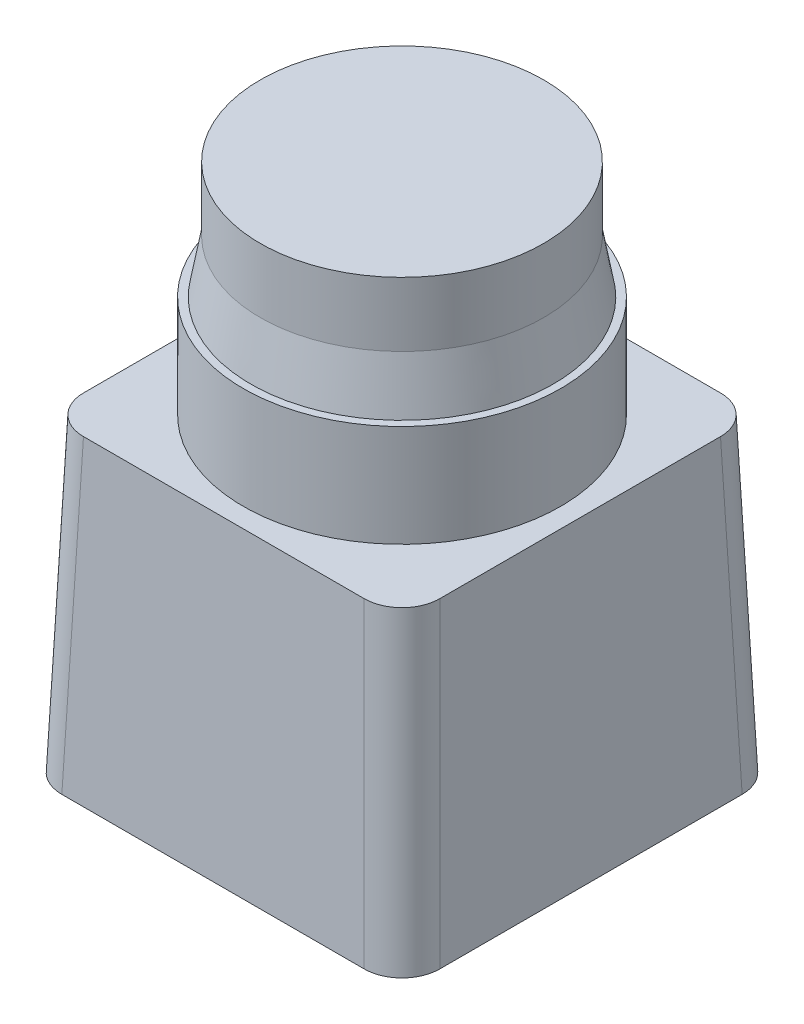
ISO-10303-21;
HEADER;
FILE_DESCRIPTION(('STEP AP214'),'2;1');
FILE_NAME('part.step','',(''),(''),'','','');
FILE_SCHEMA(('AUTOMOTIVE_DESIGN { 1 0 10303 214 1 1 1 1 }'));
ENDSEC;
DATA;
#1=APPLICATION_CONTEXT('core data for automotive mechanical design processes');
#2=APPLICATION_PROTOCOL_DEFINITION('international standard','automotive_design',2000,#1);
#3=PRODUCT_CONTEXT('',#1,'mechanical');
#4=PRODUCT('Part','Part','',(#3));
#5=PRODUCT_RELATED_PRODUCT_CATEGORY('part','',(#4));
#6=PRODUCT_DEFINITION_FORMATION('','',#4);
#7=PRODUCT_DEFINITION_CONTEXT('part definition',#1,'design');
#8=PRODUCT_DEFINITION('design','',#6,#7);
#9=PRODUCT_DEFINITION_SHAPE('','',#8);
#10=(LENGTH_UNIT() NAMED_UNIT(*) SI_UNIT(.MILLI.,.METRE.));
#11=(NAMED_UNIT(*) PLANE_ANGLE_UNIT() SI_UNIT($,.RADIAN.));
#12=(NAMED_UNIT(*) SI_UNIT($,.STERADIAN.) SOLID_ANGLE_UNIT());
#13=UNCERTAINTY_MEASURE_WITH_UNIT(LENGTH_MEASURE(1.E-05),#10,'distance_accuracy_value','');
#14=(GEOMETRIC_REPRESENTATION_CONTEXT(3) GLOBAL_UNCERTAINTY_ASSIGNED_CONTEXT((#13)) GLOBAL_UNIT_ASSIGNED_CONTEXT((#10,
#11,#12)) REPRESENTATION_CONTEXT('',''));
#15=CARTESIAN_POINT('',(0.,0.,0.));
#16=DIRECTION('',(0.,0.,1.));
#17=DIRECTION('',(1.,0.,0.));
#18=AXIS2_PLACEMENT_3D('',#15,#16,#17);
#19=CARTESIAN_POINT('',(-25.,0.,-25.));
#20=DIRECTION('',(-0.999390827019096,0.034899496702501,0.));
#21=DIRECTION('',(-0.034899496702501,-0.999390827019096,0.));
#22=AXIS2_PLACEMENT_3D('',#19,#20,#21);
#23=PLANE('',#22);
#24=DIRECTION('',(0.,0.,1.));
#25=VECTOR('',#24,1.);
#26=CARTESIAN_POINT('',(-25.,0.,-25.));
#27=LINE('',#26,#25);
#28=CARTESIAN_POINT('',(-25.,0.,-20.0030458649045));
#29=VERTEX_POINT('',#28);
#30=CARTESIAN_POINT('',(-25.,0.,20.0030458649045));
#31=VERTEX_POINT('',#30);
#32=EDGE_CURVE('E277',#29,#31,#27,.T.);
#33=ORIENTED_EDGE('',*,*,#32,.T.);
#34=DIRECTION('',(0.0348782627423746,0.998782765958718,-0.0348782627423747));
#35=VECTOR('',#34,1.);
#36=CARTESIAN_POINT('',(-24.9452541001893,1.56771745317907,19.9482999650939));
#37=LINE('',#36,#35);
#38=CARTESIAN_POINT('',(-23.5682484508383,41.,18.5712943157429));
#39=VERTEX_POINT('',#38);
#40=EDGE_CURVE('E314',#31,#39,#37,.T.);
#41=ORIENTED_EDGE('',*,*,#40,.T.);
#42=DIRECTION('',(0.,0.,-1.));
#43=VECTOR('',#42,1.);
#44=CARTESIAN_POINT('',(-23.5682484508384,41.,-25.));
#45=LINE('',#44,#43);
#46=CARTESIAN_POINT('',(-23.5682484508384,41.,-18.5712943157429));
#47=VERTEX_POINT('',#46);
#48=EDGE_CURVE('E289',#47,#39,#45,.F.);
#49=ORIENTED_EDGE('',*,*,#48,.F.);
#50=DIRECTION('',(0.0348782627423747,0.998782765958718,0.0348782627423747));
#51=VECTOR('',#50,1.);
#52=CARTESIAN_POINT('',(-25.0060787607857,-0.174072933504123,-20.0091246256902));
#53=LINE('',#52,#51);
#54=EDGE_CURVE('E311',#47,#29,#53,.F.);
#55=ORIENTED_EDGE('',*,*,#54,.T.);
#56=EDGE_LOOP('',(#33,#41,#49,#55));
#57=FACE_BOUND('',#56,.T.);
#58=CARTESIAN_POINT('',(-24.7939674599987,5.9,16.1));
#59=DIRECTION('',(-0.999390827019096,0.034899496702501,0.));
#60=DIRECTION('',(-0.034899496702501,-0.999390827019096,0.));
#61=AXIS2_PLACEMENT_3D('',#58,#59,#60);
#62=ELLIPSE('',#61,1.00060954429882,1.);
#63=CARTESIAN_POINT('',(-24.8288882294904,4.9,16.1));
#64=VERTEX_POINT('',#63);
#65=CARTESIAN_POINT('',(-24.7939674599987,5.9,17.1));
#66=VERTEX_POINT('',#65);
#67=EDGE_CURVE('E11',#64,#66,#62,.T.);
#68=ORIENTED_EDGE('',*,*,#67,.F.);
#69=DIRECTION('',(0.,0.,-1.));
#70=VECTOR('',#69,1.);
#71=CARTESIAN_POINT('',(-24.8288882294904,4.89999999999999,-25.));
#72=LINE('',#71,#70);
#73=CARTESIAN_POINT('',(-24.8288882294904,4.9,11.1));
#74=VERTEX_POINT('',#73);
#75=EDGE_CURVE('E45',#74,#64,#72,.F.);
#76=ORIENTED_EDGE('',*,*,#75,.F.);
#77=CARTESIAN_POINT('',(-24.7939674599987,5.9,11.1));
#78=DIRECTION('',(-0.999390827019096,0.034899496702501,0.));
#79=DIRECTION('',(-0.034899496702501,-0.999390827019096,0.));
#80=AXIS2_PLACEMENT_3D('',#77,#78,#79);
#81=ELLIPSE('',#80,1.00060954429882,1.);
#82=CARTESIAN_POINT('',(-24.7939674599987,5.9,10.1));
#83=VERTEX_POINT('',#82);
#84=EDGE_CURVE('E344',#83,#74,#81,.T.);
#85=ORIENTED_EDGE('',*,*,#84,.F.);
#86=DIRECTION('',(0.034899496702501,0.999390827019096,0.));
#87=VECTOR('',#86,1.);
#88=CARTESIAN_POINT('',(-25.,0.,10.1));
#89=LINE('',#88,#87);
#90=CARTESIAN_POINT('',(-24.7241259210152,7.9,10.1));
#91=VERTEX_POINT('',#90);
#92=EDGE_CURVE('E342',#91,#83,#89,.F.);
#93=ORIENTED_EDGE('',*,*,#92,.F.);
#94=CARTESIAN_POINT('',(-24.7241259210152,7.9,11.1));
#95=DIRECTION('',(-0.999390827019096,0.034899496702501,0.));
#96=DIRECTION('',(-0.034899496702501,-0.999390827019096,0.));
#97=AXIS2_PLACEMENT_3D('',#94,#95,#96);
#98=ELLIPSE('',#97,1.00060954429882,1.);
#99=CARTESIAN_POINT('',(-24.6892051515234,8.9,11.1));
#100=VERTEX_POINT('',#99);
#101=EDGE_CURVE('E340',#100,#91,#98,.T.);
#102=ORIENTED_EDGE('',*,*,#101,.F.);
#103=DIRECTION('',(0.,0.,1.));
#104=VECTOR('',#103,1.);
#105=CARTESIAN_POINT('',(-24.6892051515235,8.90000000000002,-25.));
#106=LINE('',#105,#104);
#107=CARTESIAN_POINT('',(-24.6892051515234,8.9,16.1));
#108=VERTEX_POINT('',#107);
#109=EDGE_CURVE('E338',#108,#100,#106,.F.);
#110=ORIENTED_EDGE('',*,*,#109,.F.);
#111=CARTESIAN_POINT('',(-24.7241259210152,7.9,16.1));
#112=DIRECTION('',(-0.999390827019096,0.034899496702501,0.));
#113=DIRECTION('',(-0.034899496702501,-0.999390827019096,0.));
#114=AXIS2_PLACEMENT_3D('',#111,#112,#113);
#115=ELLIPSE('',#114,1.00060954429882,1.);
#116=CARTESIAN_POINT('',(-24.7241259210152,7.9,17.1));
#117=VERTEX_POINT('',#116);
#118=EDGE_CURVE('E336',#117,#108,#115,.T.);
#119=ORIENTED_EDGE('',*,*,#118,.F.);
#120=DIRECTION('',(-0.034899496702501,-0.999390827019096,0.));
#121=VECTOR('',#120,1.);
#122=CARTESIAN_POINT('',(-25.,0.,17.1));
#123=LINE('',#122,#121);
#124=EDGE_CURVE('E334',#66,#117,#123,.F.);
#125=ORIENTED_EDGE('',*,*,#124,.F.);
#126=EDGE_LOOP('',(#68,#76,#85,#93,#102,#110,#119,#125));
#127=FACE_BOUND('',#126,.T.);
#128=ADVANCED_FACE('F37',(#57,#127),#23,.T.);
#129=CARTESIAN_POINT('',(25.,0.,-25.));
#130=DIRECTION('',(0.999390827019096,0.034899496702501,0.));
#131=DIRECTION('',(-0.034899496702501,0.999390827019096,0.));
#132=AXIS2_PLACEMENT_3D('',#129,#130,#131);
#133=PLANE('',#132);
#134=DIRECTION('',(0.,0.,1.));
#135=VECTOR('',#134,1.);
#136=CARTESIAN_POINT('',(23.5682484508383,41.,-25.));
#137=LINE('',#136,#135);
#138=CARTESIAN_POINT('',(23.5682484508383,41.,18.5712943157429));
#139=VERTEX_POINT('',#138);
#140=CARTESIAN_POINT('',(23.5682484508383,41.,-18.5712943157429));
#141=VERTEX_POINT('',#140);
#142=EDGE_CURVE('E283',#139,#141,#137,.F.);
#143=ORIENTED_EDGE('',*,*,#142,.F.);
#144=DIRECTION('',(-0.0348782627423747,0.998782765958718,-0.0348782627423747));
#145=VECTOR('',#144,1.);
#146=CARTESIAN_POINT('',(24.9452541001893,1.56771745317907,19.9482999650939));
#147=LINE('',#146,#145);
#148=CARTESIAN_POINT('',(25.,0.,20.0030458649045));
#149=VERTEX_POINT('',#148);
#150=EDGE_CURVE('E331',#139,#149,#147,.F.);
#151=ORIENTED_EDGE('',*,*,#150,.T.);
#152=DIRECTION('',(0.,0.,-1.));
#153=VECTOR('',#152,1.);
#154=CARTESIAN_POINT('',(25.,0.,-25.));
#155=LINE('',#154,#153);
#156=CARTESIAN_POINT('',(25.,0.,-20.0030458649045));
#157=VERTEX_POINT('',#156);
#158=EDGE_CURVE('E271',#149,#157,#155,.T.);
#159=ORIENTED_EDGE('',*,*,#158,.T.);
#160=DIRECTION('',(-0.0348782627423746,0.998782765958718,0.0348782627423747));
#161=VECTOR('',#160,1.);
#162=CARTESIAN_POINT('',(25.0060787607856,-0.174072933504123,-20.0091246256902));
#163=LINE('',#162,#161);
#164=EDGE_CURVE('E329',#157,#141,#163,.T.);
#165=ORIENTED_EDGE('',*,*,#164,.T.);
#166=EDGE_LOOP('',(#143,#151,#159,#165));
#167=FACE_BOUND('',#166,.T.);
#168=ADVANCED_FACE('F405',(#167),#133,.T.);
#169=CARTESIAN_POINT('',(-25.,0.,-25.));
#170=DIRECTION('',(0.,0.034899496702501,-0.999390827019096));
#171=DIRECTION('',(0.,0.999390827019096,0.034899496702501));
#172=AXIS2_PLACEMENT_3D('',#169,#170,#171);
#173=PLANE('',#172);
#174=DIRECTION('',(-1.,0.,0.));
#175=VECTOR('',#174,1.);
#176=CARTESIAN_POINT('',(-25.,0.,-25.));
#177=LINE('',#176,#175);
#178=CARTESIAN_POINT('',(20.0030458649045,0.,-25.));
#179=VERTEX_POINT('',#178);
#180=CARTESIAN_POINT('',(-20.0030458649045,0.,-25.));
#181=VERTEX_POINT('',#180);
#182=EDGE_CURVE('E274',#179,#181,#177,.T.);
#183=ORIENTED_EDGE('',*,*,#182,.T.);
#184=DIRECTION('',(0.0348782627423747,0.998782765958718,0.0348782627423746));
#185=VECTOR('',#184,1.);
#186=CARTESIAN_POINT('',(-20.0091246256902,-0.174072933504123,-25.0060787607856));
#187=LINE('',#186,#185);
#188=CARTESIAN_POINT('',(-18.5712943157429,41.,-23.5682484508383));
#189=VERTEX_POINT('',#188);
#190=EDGE_CURVE('E327',#181,#189,#187,.T.);
#191=ORIENTED_EDGE('',*,*,#190,.T.);
#192=DIRECTION('',(1.,0.,0.));
#193=VECTOR('',#192,1.);
#194=CARTESIAN_POINT('',(-25.,41.,-23.5682484508383));
#195=LINE('',#194,#193);
#196=CARTESIAN_POINT('',(18.5712943157428,41.,-23.5682484508383));
#197=VERTEX_POINT('',#196);
#198=EDGE_CURVE('E286',#197,#189,#195,.F.);
#199=ORIENTED_EDGE('',*,*,#198,.F.);
#200=DIRECTION('',(-0.0348782627423746,0.998782765958718,0.0348782627423746));
#201=VECTOR('',#200,1.);
#202=CARTESIAN_POINT('',(19.9482999650939,1.56771745317907,-24.9452541001893));
#203=LINE('',#202,#201);
#204=EDGE_CURVE('E324',#197,#179,#203,.F.);
#205=ORIENTED_EDGE('',*,*,#204,.T.);
#206=EDGE_LOOP('',(#183,#191,#199,#205));
#207=FACE_BOUND('',#206,.T.);
#208=ADVANCED_FACE('F411',(#207),#173,.T.);
#209=CARTESIAN_POINT('',(-25.,0.,25.));
#210=DIRECTION('',(0.,0.034899496702501,0.999390827019096));
#211=DIRECTION('',(0.,-0.999390827019096,0.034899496702501));
#212=AXIS2_PLACEMENT_3D('',#209,#210,#211);
#213=PLANE('',#212);
#214=DIRECTION('',(-1.,0.,0.));
#215=VECTOR('',#214,1.);
#216=CARTESIAN_POINT('',(-25.,41.,23.5682484508383));
#217=LINE('',#216,#215);
#218=CARTESIAN_POINT('',(-18.5712943157429,41.,23.5682484508383));
#219=VERTEX_POINT('',#218);
#220=CARTESIAN_POINT('',(18.5712943157429,41.,23.5682484508383));
#221=VERTEX_POINT('',#220);
#222=EDGE_CURVE('E292',#219,#221,#217,.F.);
#223=ORIENTED_EDGE('',*,*,#222,.F.);
#224=DIRECTION('',(0.0348782627423746,0.998782765958718,-0.0348782627423746));
#225=VECTOR('',#224,1.);
#226=CARTESIAN_POINT('',(-20.0091246256902,-0.174072933504123,25.0060787607857));
#227=LINE('',#226,#225);
#228=CARTESIAN_POINT('',(-20.0030458649045,0.,25.));
#229=VERTEX_POINT('',#228);
#230=EDGE_CURVE('E300',#219,#229,#227,.F.);
#231=ORIENTED_EDGE('',*,*,#230,.T.);
#232=DIRECTION('',(1.,0.,0.));
#233=VECTOR('',#232,1.);
#234=CARTESIAN_POINT('',(-25.,0.,25.));
#235=LINE('',#234,#233);
#236=CARTESIAN_POINT('',(20.0030458649045,0.,25.));
#237=VERTEX_POINT('',#236);
#238=EDGE_CURVE('E280',#229,#237,#235,.T.);
#239=ORIENTED_EDGE('',*,*,#238,.T.);
#240=DIRECTION('',(-0.0348782627423747,0.998782765958718,-0.0348782627423746));
#241=VECTOR('',#240,1.);
#242=CARTESIAN_POINT('',(19.9482999650939,1.56771745317907,24.9452541001893));
#243=LINE('',#242,#241);
#244=EDGE_CURVE('E298',#237,#221,#243,.T.);
#245=ORIENTED_EDGE('',*,*,#244,.T.);
#246=EDGE_LOOP('',(#223,#231,#239,#245));
#247=FACE_BOUND('',#246,.T.);
#248=ADVANCED_FACE('F416',(#247),#213,.T.);
#249=CARTESIAN_POINT('',(0.,41.,0.));
#250=DIRECTION('',(0.,1.,0.));
#251=DIRECTION('',(0.,0.,1.));
#252=AXIS2_PLACEMENT_3D('',#249,#250,#251);
#253=PLANE('',#252);
#254=DIRECTION('',(0.173648177666931,0.,-0.984807753012208));
#255=VECTOR('',#254,1.);
#256=CARTESIAN_POINT('',(3.82025990867248,41.,-21.6657705662686));
#257=LINE('',#256,#255);
#258=CARTESIAN_POINT('',(3.64661173100555,41.,-20.6809628132564));
#259=VERTEX_POINT('',#258);
#260=CARTESIAN_POINT('',(3.82025990867248,41.,-21.6657705662686));
#261=VERTEX_POINT('',#260);
#262=EDGE_CURVE('E234',#259,#261,#257,.T.);
#263=ORIENTED_EDGE('',*,*,#262,.F.);
#264=CARTESIAN_POINT('',(0.,41.,0.));
#265=DIRECTION('',(0.,1.,0.));
#266=DIRECTION('',(0.,0.,1.));
#267=AXIS2_PLACEMENT_3D('',#264,#265,#266);
#268=CIRCLE('',#267,21.);
#269=CARTESIAN_POINT('',(-3.64661173100555,41.,-20.6809628132564));
#270=VERTEX_POINT('',#269);
#271=EDGE_CURVE('E295',#270,#259,#268,.T.);
#272=ORIENTED_EDGE('',*,*,#271,.F.);
#273=DIRECTION('',(-0.173648177666931,0.,-0.984807753012208));
#274=VECTOR('',#273,1.);
#275=CARTESIAN_POINT('',(-3.82025990867248,41.,-21.6657705662686));
#276=LINE('',#275,#274);
#277=CARTESIAN_POINT('',(-3.82025990867248,41.,-21.6657705662686));
#278=VERTEX_POINT('',#277);
#279=EDGE_CURVE('E217',#270,#278,#276,.T.);
#280=ORIENTED_EDGE('',*,*,#279,.T.);
#281=CARTESIAN_POINT('',(0.,41.,0.));
#282=DIRECTION('',(0.,1.,0.));
#283=DIRECTION('',(0.,0.,1.));
#284=AXIS2_PLACEMENT_3D('',#281,#282,#283);
#285=CIRCLE('',#284,22.);
#286=EDGE_CURVE('E59',#261,#278,#285,.T.);
#287=ORIENTED_EDGE('',*,*,#286,.F.);
#288=EDGE_LOOP('',(#263,#272,#280,#287));
#289=FACE_BOUND('',#288,.T.);
#290=ORIENTED_EDGE('',*,*,#48,.T.);
#291=CARTESIAN_POINT('',(-18.5652007293442,41.,18.5652007293442));
#292=DIRECTION('',(0.,1.,0.));
#293=DIRECTION('',(-0.707106781186547,0.,0.707106781186548));
#294=AXIS2_PLACEMENT_3D('',#291,#292,#293);
#295=ELLIPSE('',#294,5.00609358752858,5.);
#296=EDGE_CURVE('E322',#39,#219,#295,.T.);
#297=ORIENTED_EDGE('',*,*,#296,.T.);
#298=ORIENTED_EDGE('',*,*,#222,.T.);
#299=CARTESIAN_POINT('',(18.5652007293442,41.,18.5652007293442));
#300=DIRECTION('',(0.,1.,0.));
#301=DIRECTION('',(0.707106781186548,0.,0.707106781186547));
#302=AXIS2_PLACEMENT_3D('',#299,#300,#301);
#303=ELLIPSE('',#302,5.00609358752858,5.);
#304=EDGE_CURVE('E318',#221,#139,#303,.T.);
#305=ORIENTED_EDGE('',*,*,#304,.T.);
#306=ORIENTED_EDGE('',*,*,#142,.T.);
#307=CARTESIAN_POINT('',(18.5652007293442,41.,-18.5652007293442));
#308=DIRECTION('',(0.,1.,0.));
#309=DIRECTION('',(0.707106781186547,0.,-0.707106781186548));
#310=AXIS2_PLACEMENT_3D('',#307,#308,#309);
#311=ELLIPSE('',#310,5.00609358752858,5.);
#312=EDGE_CURVE('E316',#141,#197,#311,.T.);
#313=ORIENTED_EDGE('',*,*,#312,.T.);
#314=ORIENTED_EDGE('',*,*,#198,.T.);
#315=CARTESIAN_POINT('',(-18.5652007293442,41.,-18.5652007293442));
#316=DIRECTION('',(0.,1.,0.));
#317=DIRECTION('',(-0.707106781186548,0.,-0.707106781186547));
#318=AXIS2_PLACEMENT_3D('',#315,#316,#317);
#319=ELLIPSE('',#318,5.00609358752858,5.);
#320=EDGE_CURVE('E320',#189,#47,#319,.T.);
#321=ORIENTED_EDGE('',*,*,#320,.T.);
#322=EDGE_LOOP('',(#290,#297,#298,#305,#306,#313,#314,#321));
#323=FACE_BOUND('',#322,.T.);
#324=ADVANCED_FACE('F441',(#289,#323),#253,.T.);
#325=CARTESIAN_POINT('',(0.,0.,0.));
#326=DIRECTION('',(0.,1.,0.));
#327=DIRECTION('',(0.,0.,1.));
#328=AXIS2_PLACEMENT_3D('',#325,#326,#327);
#329=PLANE('',#328);
#330=CARTESIAN_POINT('',(20.,0.,19.375));
#331=DIRECTION('',(0.,-1.,0.));
#332=DIRECTION('',(0.,0.,-1.));
#333=AXIS2_PLACEMENT_3D('',#330,#331,#332);
#334=CIRCLE('',#333,1.25);
#335=CARTESIAN_POINT('',(20.,0.,18.125));
#336=VERTEX_POINT('',#335);
#337=EDGE_CURVE('E247',#336,#336,#334,.T.);
#338=ORIENTED_EDGE('',*,*,#337,.F.);
#339=EDGE_LOOP('',(#338));
#340=FACE_BOUND('',#339,.T.);
#341=CARTESIAN_POINT('',(-20.,0.,-20.625));
#342=DIRECTION('',(0.,-1.,0.));
#343=DIRECTION('',(0.,0.,-1.));
#344=AXIS2_PLACEMENT_3D('',#341,#342,#343);
#345=CIRCLE('',#344,1.25);
#346=CARTESIAN_POINT('',(-20.,0.,-21.875));
#347=VERTEX_POINT('',#346);
#348=EDGE_CURVE('E251',#347,#347,#345,.T.);
#349=ORIENTED_EDGE('',*,*,#348,.F.);
#350=EDGE_LOOP('',(#349));
#351=FACE_BOUND('',#350,.T.);
#352=ORIENTED_EDGE('',*,*,#238,.F.);
#353=CARTESIAN_POINT('',(-19.9969522785059,0.,19.9969522785059));
#354=DIRECTION('',(0.,1.,0.));
#355=DIRECTION('',(-0.707106781186547,0.,0.707106781186548));
#356=AXIS2_PLACEMENT_3D('',#353,#354,#355);
#357=ELLIPSE('',#356,5.00609358752858,5.);
#358=EDGE_CURVE('E309',#229,#31,#357,.F.);
#359=ORIENTED_EDGE('',*,*,#358,.T.);
#360=ORIENTED_EDGE('',*,*,#32,.F.);
#361=CARTESIAN_POINT('',(-19.9969522785059,0.,-19.9969522785059));
#362=DIRECTION('',(0.,1.,0.));
#363=DIRECTION('',(-0.707106781186548,0.,-0.707106781186547));
#364=AXIS2_PLACEMENT_3D('',#361,#362,#363);
#365=ELLIPSE('',#364,5.00609358752858,5.);
#366=EDGE_CURVE('E307',#29,#181,#365,.F.);
#367=ORIENTED_EDGE('',*,*,#366,.T.);
#368=ORIENTED_EDGE('',*,*,#182,.F.);
#369=CARTESIAN_POINT('',(19.9969522785059,0.,-19.9969522785059));
#370=DIRECTION('',(0.,1.,0.));
#371=DIRECTION('',(0.707106781186547,0.,-0.707106781186548));
#372=AXIS2_PLACEMENT_3D('',#369,#370,#371);
#373=ELLIPSE('',#372,5.00609358752858,5.);
#374=EDGE_CURVE('E303',#179,#157,#373,.F.);
#375=ORIENTED_EDGE('',*,*,#374,.T.);
#376=ORIENTED_EDGE('',*,*,#158,.F.);
#377=CARTESIAN_POINT('',(19.9969522785059,0.,19.9969522785059));
#378=DIRECTION('',(0.,1.,0.));
#379=DIRECTION('',(0.707106781186548,0.,0.707106781186547));
#380=AXIS2_PLACEMENT_3D('',#377,#378,#379);
#381=ELLIPSE('',#380,5.00609358752858,5.);
#382=EDGE_CURVE('E305',#149,#237,#381,.F.);
#383=ORIENTED_EDGE('',*,*,#382,.T.);
#384=EDGE_LOOP('',(#352,#359,#360,#367,#368,#375,#376,#383));
#385=FACE_BOUND('',#384,.T.);
#386=ADVANCED_FACE('F460',(#340,#351,#385),#329,.F.);
#387=CARTESIAN_POINT('',(0.,41.,0.));
#388=DIRECTION('',(0.,-1.,0.));
#389=DIRECTION('',(0.,0.,-1.));
#390=AXIS2_PLACEMENT_3D('',#387,#388,#389);
#391=CYLINDRICAL_SURFACE('',#390,21.);
#392=DIRECTION('',(0.,-1.,0.));
#393=VECTOR('',#392,1.);
#394=CARTESIAN_POINT('',(3.64661173100555,54.5,-20.6809628132564));
#395=LINE('',#394,#393);
#396=CARTESIAN_POINT('',(3.64661173100555,54.5,-20.6809628132564));
#397=VERTEX_POINT('',#396);
#398=EDGE_CURVE('E231',#397,#259,#395,.T.);
#399=ORIENTED_EDGE('',*,*,#398,.F.);
#400=CARTESIAN_POINT('',(0.,54.5,0.));
#401=DIRECTION('',(0.,-1.,0.));
#402=DIRECTION('',(0.,0.,-1.));
#403=AXIS2_PLACEMENT_3D('',#400,#401,#402);
#404=CIRCLE('',#403,21.);
#405=CARTESIAN_POINT('',(-3.64661173100554,54.5,-20.6809628132564));
#406=VERTEX_POINT('',#405);
#407=EDGE_CURVE('E268',#397,#406,#404,.T.);
#408=ORIENTED_EDGE('',*,*,#407,.T.);
#409=DIRECTION('',(0.,-1.,0.));
#410=VECTOR('',#409,1.);
#411=CARTESIAN_POINT('',(-3.64661173100554,54.5,-20.6809628132564));
#412=LINE('',#411,#410);
#413=EDGE_CURVE('E215',#406,#270,#412,.T.);
#414=ORIENTED_EDGE('',*,*,#413,.T.);
#415=ORIENTED_EDGE('',*,*,#271,.T.);
#416=EDGE_LOOP('',(#399,#408,#414,#415));
#417=FACE_BOUND('',#416,.T.);
#418=ADVANCED_FACE('F462',(#417),#391,.T.);
#419=CARTESIAN_POINT('',(0.,54.5,-3.78169717762946E-13));
#420=DIRECTION('',(0.,-1.,0.));
#421=DIRECTION('',(0.,0.,-1.));
#422=AXIS2_PLACEMENT_3D('',#419,#420,#421);
#423=PLANE('',#422);
#424=ORIENTED_EDGE('',*,*,#407,.F.);
#425=DIRECTION('',(0.173648177666931,0.,-0.984807753012208));
#426=VECTOR('',#425,1.);
#427=CARTESIAN_POINT('',(3.47296355333862,54.5,-19.6961550602442));
#428=LINE('',#427,#426);
#429=CARTESIAN_POINT('',(3.47296355333862,54.5,-19.6961550602442));
#430=VERTEX_POINT('',#429);
#431=EDGE_CURVE('E228',#430,#397,#428,.T.);
#432=ORIENTED_EDGE('',*,*,#431,.F.);
#433=CARTESIAN_POINT('',(0.,54.5,0.));
#434=DIRECTION('',(0.,-1.,0.));
#435=DIRECTION('',(0.,0.,-1.));
#436=AXIS2_PLACEMENT_3D('',#433,#434,#435);
#437=CIRCLE('',#436,20.);
#438=CARTESIAN_POINT('',(-3.47296355333861,54.5,-19.6961550602442));
#439=VERTEX_POINT('',#438);
#440=EDGE_CURVE('E265',#430,#439,#437,.T.);
#441=ORIENTED_EDGE('',*,*,#440,.T.);
#442=DIRECTION('',(-0.173648177666931,0.,-0.984807753012208));
#443=VECTOR('',#442,1.);
#444=CARTESIAN_POINT('',(-3.47296355333861,54.5,-19.6961550602442));
#445=LINE('',#444,#443);
#446=EDGE_CURVE('E208',#439,#406,#445,.T.);
#447=ORIENTED_EDGE('',*,*,#446,.T.);
#448=EDGE_LOOP('',(#424,#432,#441,#447));
#449=FACE_BOUND('',#448,.T.);
#450=ADVANCED_FACE('F469',(#449),#423,.F.);
#451=CARTESIAN_POINT('',(0.,61.5,0.));
#452=DIRECTION('',(0.,-1.,0.));
#453=DIRECTION('',(0.,0.,-1.));
#454=AXIS2_PLACEMENT_3D('',#451,#452,#453);
#455=CONICAL_SURFACE('',#454,18.75,0.176708856070038);
#456=ORIENTED_EDGE('',*,*,#440,.F.);
#457=DIRECTION('',(0.0305257240235937,-0.984427575508481,-0.173119983685674));
#458=VECTOR('',#457,1.);
#459=CARTESIAN_POINT('',(3.30241623598717,60.,-18.7289331599643));
#460=LINE('',#459,#458);
#461=CARTESIAN_POINT('',(3.30241623598717,60.,-18.7289331599643));
#462=VERTEX_POINT('',#461);
#463=EDGE_CURVE('E225',#462,#430,#460,.T.);
#464=ORIENTED_EDGE('',*,*,#463,.F.);
#465=CARTESIAN_POINT('',(0.,60.,0.));
#466=DIRECTION('',(0.,1.,0.));
#467=DIRECTION('',(0.,0.,1.));
#468=AXIS2_PLACEMENT_3D('',#465,#466,#467);
#469=CIRCLE('',#468,19.0178571428571);
#470=CARTESIAN_POINT('',(-3.30241623598716,60.,-18.7289331599643));
#471=VERTEX_POINT('',#470);
#472=EDGE_CURVE('E242',#462,#471,#469,.T.);
#473=ORIENTED_EDGE('',*,*,#472,.T.);
#474=DIRECTION('',(-0.0305257240235937,-0.984427575508481,-0.173119983685674));
#475=VECTOR('',#474,1.);
#476=CARTESIAN_POINT('',(-3.30241623598716,60.,-18.7289331599643));
#477=LINE('',#476,#475);
#478=EDGE_CURVE('E205',#471,#439,#477,.T.);
#479=ORIENTED_EDGE('',*,*,#478,.T.);
#480=EDGE_LOOP('',(#456,#464,#473,#479));
#481=FACE_BOUND('',#480,.T.);
#482=CARTESIAN_POINT('',(0.,61.5,0.));
#483=DIRECTION('',(0.,-1.,0.));
#484=DIRECTION('',(0.,0.,-1.));
#485=AXIS2_PLACEMENT_3D('',#482,#483,#484);
#486=CIRCLE('',#485,18.75);
#487=CARTESIAN_POINT('',(0.,61.5,-18.75));
#488=VERTEX_POINT('',#487);
#489=EDGE_CURVE('E262',#488,#488,#486,.T.);
#490=ORIENTED_EDGE('',*,*,#489,.T.);
#491=EDGE_LOOP('',(#490));
#492=FACE_BOUND('',#491,.T.);
#493=ADVANCED_FACE('F478',(#481,#492),#455,.T.);
#494=CARTESIAN_POINT('',(0.,41.,0.));
#495=DIRECTION('',(0.,-1.,0.));
#496=DIRECTION('',(0.,0.,-1.));
#497=AXIS2_PLACEMENT_3D('',#494,#495,#496);
#498=CYLINDRICAL_SURFACE('',#497,18.75);
#499=ORIENTED_EDGE('',*,*,#489,.F.);
#500=EDGE_LOOP('',(#499));
#501=FACE_BOUND('',#500,.T.);
#502=CARTESIAN_POINT('',(0.,70.,0.));
#503=DIRECTION('',(0.,-1.,0.));
#504=DIRECTION('',(0.,0.,-1.));
#505=AXIS2_PLACEMENT_3D('',#502,#503,#504);
#506=CIRCLE('',#505,18.75);
#507=CARTESIAN_POINT('',(0.,70.,-18.75));
#508=VERTEX_POINT('',#507);
#509=EDGE_CURVE('E257',#508,#508,#506,.T.);
#510=ORIENTED_EDGE('',*,*,#509,.T.);
#511=EDGE_LOOP('',(#510));
#512=FACE_BOUND('',#511,.T.);
#513=ADVANCED_FACE('F482',(#501,#512),#498,.T.);
#514=CARTESIAN_POINT('',(0.,70.,0.));
#515=DIRECTION('',(0.,-1.,0.));
#516=DIRECTION('',(0.,0.,-1.));
#517=AXIS2_PLACEMENT_3D('',#514,#515,#516);
#518=PLANE('',#517);
#519=ORIENTED_EDGE('',*,*,#509,.F.);
#520=EDGE_LOOP('',(#519));
#521=FACE_BOUND('',#520,.T.);
#522=ADVANCED_FACE('F424',(#521),#518,.F.);
#523=CARTESIAN_POINT('',(-20.0091246256902,-0.348570417016628,20.0091246256902));
#524=DIRECTION('',(-0.0348782627423746,-0.998782765958718,0.0348782627423747));
#525=DIRECTION('',(0.,-0.034899496702501,-0.999390827019096));
#526=AXIS2_PLACEMENT_3D('',#523,#524,#525);
#527=CYLINDRICAL_SURFACE('',#526,5.);
#528=ORIENTED_EDGE('',*,*,#296,.F.);
#529=ORIENTED_EDGE('',*,*,#40,.F.);
#530=ORIENTED_EDGE('',*,*,#358,.F.);
#531=ORIENTED_EDGE('',*,*,#230,.F.);
#532=EDGE_LOOP('',(#528,#529,#530,#531));
#533=FACE_BOUND('',#532,.T.);
#534=ADVANCED_FACE('F420',(#533),#527,.T.);
#535=CARTESIAN_POINT('',(-20.0091246256902,-0.348570417016628,-20.0091246256902));
#536=DIRECTION('',(-0.0348782627423747,-0.998782765958718,-0.0348782627423747));
#537=DIRECTION('',(0.999390827019096,-0.034899496702501,0.));
#538=AXIS2_PLACEMENT_3D('',#535,#536,#537);
#539=CYLINDRICAL_SURFACE('',#538,5.);
#540=ORIENTED_EDGE('',*,*,#320,.F.);
#541=ORIENTED_EDGE('',*,*,#190,.F.);
#542=ORIENTED_EDGE('',*,*,#366,.F.);
#543=ORIENTED_EDGE('',*,*,#54,.F.);
#544=EDGE_LOOP('',(#540,#541,#542,#543));
#545=FACE_BOUND('',#544,.T.);
#546=ADVANCED_FACE('F423',(#545),#539,.T.);
#547=CARTESIAN_POINT('',(19.9482999650939,1.39321996966657,19.9482999650939));
#548=DIRECTION('',(0.0348782627423747,-0.998782765958718,0.0348782627423747));
#549=DIRECTION('',(0.999390827019096,0.034899496702501,0.));
#550=AXIS2_PLACEMENT_3D('',#547,#548,#549);
#551=CYLINDRICAL_SURFACE('',#550,5.);
#552=ORIENTED_EDGE('',*,*,#304,.F.);
#553=ORIENTED_EDGE('',*,*,#244,.F.);
#554=ORIENTED_EDGE('',*,*,#382,.F.);
#555=ORIENTED_EDGE('',*,*,#150,.F.);
#556=EDGE_LOOP('',(#552,#553,#554,#555));
#557=FACE_BOUND('',#556,.T.);
#558=ADVANCED_FACE('F427',(#557),#551,.T.);
#559=CARTESIAN_POINT('',(19.9482999650939,1.39321996966657,-19.9482999650939));
#560=DIRECTION('',(0.0348782627423746,-0.998782765958718,-0.0348782627423747));
#561=DIRECTION('',(0.,0.034899496702501,-0.999390827019096));
#562=AXIS2_PLACEMENT_3D('',#559,#560,#561);
#563=CYLINDRICAL_SURFACE('',#562,5.);
#564=ORIENTED_EDGE('',*,*,#312,.F.);
#565=ORIENTED_EDGE('',*,*,#164,.F.);
#566=ORIENTED_EDGE('',*,*,#374,.F.);
#567=ORIENTED_EDGE('',*,*,#204,.F.);
#568=EDGE_LOOP('',(#564,#565,#566,#567));
#569=FACE_BOUND('',#568,.T.);
#570=ADVANCED_FACE('F39',(#569),#563,.T.);
#571=CARTESIAN_POINT('',(-20.,6.,-20.625));
#572=DIRECTION('',(0.,-1.,0.));
#573=DIRECTION('',(0.,0.,-1.));
#574=AXIS2_PLACEMENT_3D('',#571,#572,#573);
#575=CYLINDRICAL_SURFACE('',#574,1.25);
#576=CARTESIAN_POINT('',(-20.,6.,-20.625));
#577=DIRECTION('',(0.,-1.,0.));
#578=DIRECTION('',(0.,0.,-1.));
#579=AXIS2_PLACEMENT_3D('',#576,#577,#578);
#580=CIRCLE('',#579,1.25);
#581=CARTESIAN_POINT('',(-20.,6.,-21.875));
#582=VERTEX_POINT('',#581);
#583=EDGE_CURVE('E254',#582,#582,#580,.T.);
#584=ORIENTED_EDGE('',*,*,#583,.F.);
#585=EDGE_LOOP('',(#584));
#586=FACE_BOUND('',#585,.T.);
#587=ORIENTED_EDGE('',*,*,#348,.T.);
#588=EDGE_LOOP('',(#587));
#589=FACE_BOUND('',#588,.T.);
#590=ADVANCED_FACE('F434',(#586,#589),#575,.F.);
#591=CARTESIAN_POINT('',(-20.,6.,-20.625));
#592=DIRECTION('',(0.,-1.,0.));
#593=DIRECTION('',(0.,0.,-1.));
#594=AXIS2_PLACEMENT_3D('',#591,#592,#593);
#595=PLANE('',#594);
#596=ORIENTED_EDGE('',*,*,#583,.T.);
#597=EDGE_LOOP('',(#596));
#598=FACE_BOUND('',#597,.T.);
#599=ADVANCED_FACE('F492',(#598),#595,.T.);
#600=CARTESIAN_POINT('',(20.,6.,19.375));
#601=DIRECTION('',(0.,-1.,0.));
#602=DIRECTION('',(0.,0.,-1.));
#603=AXIS2_PLACEMENT_3D('',#600,#601,#602);
#604=CYLINDRICAL_SURFACE('',#603,1.25);
#605=CARTESIAN_POINT('',(20.,6.,19.375));
#606=DIRECTION('',(0.,-1.,0.));
#607=DIRECTION('',(0.,0.,-1.));
#608=AXIS2_PLACEMENT_3D('',#605,#606,#607);
#609=CIRCLE('',#608,1.25);
#610=CARTESIAN_POINT('',(20.,6.,18.125));
#611=VERTEX_POINT('',#610);
#612=EDGE_CURVE('E248',#611,#611,#609,.T.);
#613=ORIENTED_EDGE('',*,*,#612,.F.);
#614=EDGE_LOOP('',(#613));
#615=FACE_BOUND('',#614,.T.);
#616=ORIENTED_EDGE('',*,*,#337,.T.);
#617=EDGE_LOOP('',(#616));
#618=FACE_BOUND('',#617,.T.);
#619=ADVANCED_FACE('F496',(#615,#618),#604,.F.);
#620=CARTESIAN_POINT('',(20.,6.,19.375));
#621=DIRECTION('',(0.,-1.,0.));
#622=DIRECTION('',(0.,0.,-1.));
#623=AXIS2_PLACEMENT_3D('',#620,#621,#622);
#624=PLANE('',#623);
#625=ORIENTED_EDGE('',*,*,#612,.T.);
#626=EDGE_LOOP('',(#625));
#627=FACE_BOUND('',#626,.T.);
#628=ADVANCED_FACE('F500',(#627),#624,.T.);
#629=CARTESIAN_POINT('',(0.,54.5,0.));
#630=DIRECTION('',(0.,1.,0.));
#631=DIRECTION('',(0.,0.,1.));
#632=AXIS2_PLACEMENT_3D('',#629,#630,#631);
#633=CYLINDRICAL_SURFACE('',#632,22.);
#634=CARTESIAN_POINT('',(0.,60.,0.));
#635=DIRECTION('',(0.,1.,0.));
#636=DIRECTION('',(0.,0.,1.));
#637=AXIS2_PLACEMENT_3D('',#634,#635,#636);
#638=CIRCLE('',#637,22.);
#639=CARTESIAN_POINT('',(3.82025990867248,60.,-21.6657705662686));
#640=VERTEX_POINT('',#639);
#641=CARTESIAN_POINT('',(-3.82025990867247,60.,-21.6657705662686));
#642=VERTEX_POINT('',#641);
#643=EDGE_CURVE('E244',#640,#642,#638,.T.);
#644=ORIENTED_EDGE('',*,*,#643,.F.);
#645=DIRECTION('',(0.,1.,0.));
#646=VECTOR('',#645,1.);
#647=CARTESIAN_POINT('',(3.82025990867248,60.,-21.6657705662686));
#648=LINE('',#647,#646);
#649=EDGE_CURVE('E236',#261,#640,#648,.T.);
#650=ORIENTED_EDGE('',*,*,#649,.F.);
#651=ORIENTED_EDGE('',*,*,#286,.T.);
#652=DIRECTION('',(0.,1.,0.));
#653=VECTOR('',#652,1.);
#654=CARTESIAN_POINT('',(-3.82025990867247,60.,-21.6657705662686));
#655=LINE('',#654,#653);
#656=EDGE_CURVE('E219',#278,#642,#655,.T.);
#657=ORIENTED_EDGE('',*,*,#656,.T.);
#658=EDGE_LOOP('',(#644,#650,#651,#657));
#659=FACE_BOUND('',#658,.T.);
#660=ADVANCED_FACE('F504',(#659),#633,.T.);
#661=CARTESIAN_POINT('',(3.30241623598717,60.,-18.7289331599643));
#662=DIRECTION('',(0.,-1.,0.));
#663=DIRECTION('',(0.,0.,-1.));
#664=AXIS2_PLACEMENT_3D('',#661,#662,#663);
#665=PLANE('',#664);
#666=DIRECTION('',(-0.173648177666931,0.,0.984807753012208));
#667=VECTOR('',#666,1.);
#668=CARTESIAN_POINT('',(3.30241623598717,60.,-18.7289331599643));
#669=LINE('',#668,#667);
#670=EDGE_CURVE('E239',#640,#462,#669,.T.);
#671=ORIENTED_EDGE('',*,*,#670,.F.);
#672=ORIENTED_EDGE('',*,*,#643,.T.);
#673=DIRECTION('',(0.173648177666931,0.,0.984807753012208));
#674=VECTOR('',#673,1.);
#675=CARTESIAN_POINT('',(-3.30241623598716,60.,-18.7289331599643));
#676=LINE('',#675,#674);
#677=EDGE_CURVE('E222',#642,#471,#676,.T.);
#678=ORIENTED_EDGE('',*,*,#677,.T.);
#679=ORIENTED_EDGE('',*,*,#472,.F.);
#680=EDGE_LOOP('',(#671,#672,#678,#679));
#681=FACE_BOUND('',#680,.T.);
#682=ADVANCED_FACE('F508',(#681),#665,.F.);
#683=CARTESIAN_POINT('',(0.,0.,0.));
#684=DIRECTION('',(0.984807753012208,0.,0.173648177666931));
#685=DIRECTION('',(0.173648177666931,0.,-0.984807753012208));
#686=AXIS2_PLACEMENT_3D('',#683,#684,#685);
#687=PLANE('',#686);
#688=ORIENTED_EDGE('',*,*,#463,.T.);
#689=ORIENTED_EDGE('',*,*,#431,.T.);
#690=ORIENTED_EDGE('',*,*,#398,.T.);
#691=ORIENTED_EDGE('',*,*,#262,.T.);
#692=ORIENTED_EDGE('',*,*,#649,.T.);
#693=ORIENTED_EDGE('',*,*,#670,.T.);
#694=EDGE_LOOP('',(#688,#689,#690,#691,#692,#693));
#695=FACE_BOUND('',#694,.T.);
#696=ADVANCED_FACE('F512',(#695),#687,.T.);
#697=CARTESIAN_POINT('',(0.,0.,0.));
#698=DIRECTION('',(0.984807753012208,0.,-0.173648177666931));
#699=DIRECTION('',(-0.173648177666931,0.,-0.984807753012208));
#700=AXIS2_PLACEMENT_3D('',#697,#698,#699);
#701=PLANE('',#700);
#702=ORIENTED_EDGE('',*,*,#478,.F.);
#703=ORIENTED_EDGE('',*,*,#677,.F.);
#704=ORIENTED_EDGE('',*,*,#656,.F.);
#705=ORIENTED_EDGE('',*,*,#279,.F.);
#706=ORIENTED_EDGE('',*,*,#413,.F.);
#707=ORIENTED_EDGE('',*,*,#446,.F.);
#708=EDGE_LOOP('',(#702,#703,#704,#705,#706,#707));
#709=FACE_BOUND('',#708,.T.);
#710=ADVANCED_FACE('F516',(#709),#701,.F.);
#711=CARTESIAN_POINT('',(-20.,5.9,16.1));
#712=DIRECTION('',(-1.,0.,0.));
#713=DIRECTION('',(0.,0.,1.));
#714=AXIS2_PLACEMENT_3D('',#711,#712,#713);
#715=CYLINDRICAL_SURFACE('',#714,1.);
#716=ORIENTED_EDGE('',*,*,#67,.T.);
#717=DIRECTION('',(-1.,0.,0.));
#718=VECTOR('',#717,1.);
#719=CARTESIAN_POINT('',(-20.,5.9,17.1));
#720=LINE('',#719,#718);
#721=CARTESIAN_POINT('',(-20.,5.9,17.1));
#722=VERTEX_POINT('',#721);
#723=EDGE_CURVE('E52',#722,#66,#720,.T.);
#724=ORIENTED_EDGE('',*,*,#723,.F.);
#725=CARTESIAN_POINT('',(-20.,5.9,16.1));
#726=DIRECTION('',(1.,0.,0.));
#727=DIRECTION('',(0.,0.,-1.));
#728=AXIS2_PLACEMENT_3D('',#725,#726,#727);
#729=CIRCLE('',#728,1.);
#730=CARTESIAN_POINT('',(-20.,4.9,16.1));
#731=VERTEX_POINT('',#730);
#732=EDGE_CURVE('E189',#722,#731,#729,.T.);
#733=ORIENTED_EDGE('',*,*,#732,.T.);
#734=DIRECTION('',(-1.,0.,0.));
#735=VECTOR('',#734,1.);
#736=CARTESIAN_POINT('',(-20.,4.9,16.1));
#737=LINE('',#736,#735);
#738=EDGE_CURVE('E200',#731,#64,#737,.T.);
#739=ORIENTED_EDGE('',*,*,#738,.T.);
#740=EDGE_LOOP('',(#716,#724,#733,#739));
#741=FACE_BOUND('',#740,.T.);
#742=ADVANCED_FACE('F199',(#741),#715,.F.);
#743=CARTESIAN_POINT('',(-20.,4.9,16.1));
#744=DIRECTION('',(0.,1.,0.));
#745=DIRECTION('',(0.,0.,1.));
#746=AXIS2_PLACEMENT_3D('',#743,#744,#745);
#747=PLANE('',#746);
#748=ORIENTED_EDGE('',*,*,#75,.T.);
#749=ORIENTED_EDGE('',*,*,#738,.F.);
#750=DIRECTION('',(0.,0.,-1.));
#751=VECTOR('',#750,1.);
#752=CARTESIAN_POINT('',(-20.,4.9,16.1));
#753=LINE('',#752,#751);
#754=CARTESIAN_POINT('',(-20.,4.9,11.1));
#755=VERTEX_POINT('',#754);
#756=EDGE_CURVE('E185',#731,#755,#753,.T.);
#757=ORIENTED_EDGE('',*,*,#756,.T.);
#758=DIRECTION('',(-1.,0.,0.));
#759=VECTOR('',#758,1.);
#760=CARTESIAN_POINT('',(-20.,4.9,11.1));
#761=LINE('',#760,#759);
#762=EDGE_CURVE('E206',#755,#74,#761,.T.);
#763=ORIENTED_EDGE('',*,*,#762,.T.);
#764=EDGE_LOOP('',(#748,#749,#757,#763));
#765=FACE_BOUND('',#764,.T.);
#766=ADVANCED_FACE('F203',(#765),#747,.T.);
#767=CARTESIAN_POINT('',(-20.,5.9,11.1));
#768=DIRECTION('',(-1.,0.,0.));
#769=DIRECTION('',(0.,0.,1.));
#770=AXIS2_PLACEMENT_3D('',#767,#768,#769);
#771=CYLINDRICAL_SURFACE('',#770,1.);
#772=ORIENTED_EDGE('',*,*,#84,.T.);
#773=ORIENTED_EDGE('',*,*,#762,.F.);
#774=CARTESIAN_POINT('',(-20.,5.9,11.1));
#775=DIRECTION('',(1.,0.,0.));
#776=DIRECTION('',(0.,0.,-1.));
#777=AXIS2_PLACEMENT_3D('',#774,#775,#776);
#778=CIRCLE('',#777,1.);
#779=CARTESIAN_POINT('',(-20.,5.9,10.1));
#780=VERTEX_POINT('',#779);
#781=EDGE_CURVE('E191',#755,#780,#778,.T.);
#782=ORIENTED_EDGE('',*,*,#781,.T.);
#783=DIRECTION('',(-1.,0.,0.));
#784=VECTOR('',#783,1.);
#785=CARTESIAN_POINT('',(-20.,5.9,10.1));
#786=LINE('',#785,#784);
#787=EDGE_CURVE('E210',#780,#83,#786,.T.);
#788=ORIENTED_EDGE('',*,*,#787,.T.);
#789=EDGE_LOOP('',(#772,#773,#782,#788));
#790=FACE_BOUND('',#789,.T.);
#791=ADVANCED_FACE('F348',(#790),#771,.F.);
#792=CARTESIAN_POINT('',(-20.,7.9,10.1));
#793=DIRECTION('',(0.,0.,1.));
#794=DIRECTION('',(1.,0.,0.));
#795=AXIS2_PLACEMENT_3D('',#792,#793,#794);
#796=PLANE('',#795);
#797=ORIENTED_EDGE('',*,*,#92,.T.);
#798=ORIENTED_EDGE('',*,*,#787,.F.);
#799=DIRECTION('',(0.,1.,0.));
#800=VECTOR('',#799,1.);
#801=CARTESIAN_POINT('',(-20.,7.9,10.1));
#802=LINE('',#801,#800);
#803=CARTESIAN_POINT('',(-20.,7.9,10.1));
#804=VERTEX_POINT('',#803);
#805=EDGE_CURVE('E380',#780,#804,#802,.T.);
#806=ORIENTED_EDGE('',*,*,#805,.T.);
#807=DIRECTION('',(-1.,0.,0.));
#808=VECTOR('',#807,1.);
#809=CARTESIAN_POINT('',(-20.,7.9,10.1));
#810=LINE('',#809,#808);
#811=EDGE_CURVE('E375',#804,#91,#810,.T.);
#812=ORIENTED_EDGE('',*,*,#811,.T.);
#813=EDGE_LOOP('',(#797,#798,#806,#812));
#814=FACE_BOUND('',#813,.T.);
#815=ADVANCED_FACE('F379',(#814),#796,.T.);
#816=CARTESIAN_POINT('',(-20.,7.9,11.1));
#817=DIRECTION('',(-1.,0.,0.));
#818=DIRECTION('',(0.,0.,1.));
#819=AXIS2_PLACEMENT_3D('',#816,#817,#818);
#820=CYLINDRICAL_SURFACE('',#819,1.);
#821=ORIENTED_EDGE('',*,*,#101,.T.);
#822=ORIENTED_EDGE('',*,*,#811,.F.);
#823=CARTESIAN_POINT('',(-20.,7.9,11.1));
#824=DIRECTION('',(1.,0.,0.));
#825=DIRECTION('',(0.,0.,1.));
#826=AXIS2_PLACEMENT_3D('',#823,#824,#825);
#827=CIRCLE('',#826,1.);
#828=CARTESIAN_POINT('',(-20.,8.9,11.1));
#829=VERTEX_POINT('',#828);
#830=EDGE_CURVE('E386',#804,#829,#827,.T.);
#831=ORIENTED_EDGE('',*,*,#830,.T.);
#832=DIRECTION('',(-1.,0.,0.));
#833=VECTOR('',#832,1.);
#834=CARTESIAN_POINT('',(-20.,8.9,11.1));
#835=LINE('',#834,#833);
#836=EDGE_CURVE('E367',#829,#100,#835,.T.);
#837=ORIENTED_EDGE('',*,*,#836,.T.);
#838=EDGE_LOOP('',(#821,#822,#831,#837));
#839=FACE_BOUND('',#838,.T.);
#840=ADVANCED_FACE('F384',(#839),#820,.F.);
#841=CARTESIAN_POINT('',(-20.,8.9,16.1));
#842=DIRECTION('',(0.,-1.,0.));
#843=DIRECTION('',(0.,0.,-1.));
#844=AXIS2_PLACEMENT_3D('',#841,#842,#843);
#845=PLANE('',#844);
#846=ORIENTED_EDGE('',*,*,#109,.T.);
#847=ORIENTED_EDGE('',*,*,#836,.F.);
#848=DIRECTION('',(0.,0.,1.));
#849=VECTOR('',#848,1.);
#850=CARTESIAN_POINT('',(-20.,8.9,16.1));
#851=LINE('',#850,#849);
#852=CARTESIAN_POINT('',(-20.,8.9,16.1));
#853=VERTEX_POINT('',#852);
#854=EDGE_CURVE('E390',#829,#853,#851,.T.);
#855=ORIENTED_EDGE('',*,*,#854,.T.);
#856=DIRECTION('',(-1.,0.,0.));
#857=VECTOR('',#856,1.);
#858=CARTESIAN_POINT('',(-20.,8.9,16.1));
#859=LINE('',#858,#857);
#860=EDGE_CURVE('E365',#853,#108,#859,.T.);
#861=ORIENTED_EDGE('',*,*,#860,.T.);
#862=EDGE_LOOP('',(#846,#847,#855,#861));
#863=FACE_BOUND('',#862,.T.);
#864=ADVANCED_FACE('F389',(#863),#845,.T.);
#865=CARTESIAN_POINT('',(-20.,7.9,16.1));
#866=DIRECTION('',(-1.,0.,0.));
#867=DIRECTION('',(0.,0.,1.));
#868=AXIS2_PLACEMENT_3D('',#865,#866,#867);
#869=CYLINDRICAL_SURFACE('',#868,1.);
#870=ORIENTED_EDGE('',*,*,#118,.T.);
#871=ORIENTED_EDGE('',*,*,#860,.F.);
#872=CARTESIAN_POINT('',(-20.,7.9,16.1));
#873=DIRECTION('',(1.,0.,0.));
#874=DIRECTION('',(0.,0.,-1.));
#875=AXIS2_PLACEMENT_3D('',#872,#873,#874);
#876=CIRCLE('',#875,1.);
#877=CARTESIAN_POINT('',(-20.,7.9,17.1));
#878=VERTEX_POINT('',#877);
#879=EDGE_CURVE('E364',#853,#878,#876,.T.);
#880=ORIENTED_EDGE('',*,*,#879,.T.);
#881=DIRECTION('',(-1.,0.,0.));
#882=VECTOR('',#881,1.);
#883=CARTESIAN_POINT('',(-20.,7.9,17.1));
#884=LINE('',#883,#882);
#885=EDGE_CURVE('E358',#878,#117,#884,.T.);
#886=ORIENTED_EDGE('',*,*,#885,.T.);
#887=EDGE_LOOP('',(#870,#871,#880,#886));
#888=FACE_BOUND('',#887,.T.);
#889=ADVANCED_FACE('F360',(#888),#869,.F.);
#890=CARTESIAN_POINT('',(-20.,7.9,17.1));
#891=DIRECTION('',(0.,0.,-1.));
#892=DIRECTION('',(-1.,0.,0.));
#893=AXIS2_PLACEMENT_3D('',#890,#891,#892);
#894=PLANE('',#893);
#895=ORIENTED_EDGE('',*,*,#124,.T.);
#896=ORIENTED_EDGE('',*,*,#885,.F.);
#897=DIRECTION('',(0.,-1.,0.));
#898=VECTOR('',#897,1.);
#899=CARTESIAN_POINT('',(-20.,7.9,17.1));
#900=LINE('',#899,#898);
#901=EDGE_CURVE('E369',#878,#722,#900,.T.);
#902=ORIENTED_EDGE('',*,*,#901,.T.);
#903=ORIENTED_EDGE('',*,*,#723,.T.);
#904=EDGE_LOOP('',(#895,#896,#902,#903));
#905=FACE_BOUND('',#904,.T.);
#906=ADVANCED_FACE('F357',(#905),#894,.T.);
#907=CARTESIAN_POINT('',(-20.,5.9,16.1));
#908=DIRECTION('',(1.,0.,0.));
#909=DIRECTION('',(0.,0.,-1.));
#910=AXIS2_PLACEMENT_3D('',#907,#908,#909);
#911=PLANE('',#910);
#912=ORIENTED_EDGE('',*,*,#732,.F.);
#913=ORIENTED_EDGE('',*,*,#901,.F.);
#914=ORIENTED_EDGE('',*,*,#879,.F.);
#915=ORIENTED_EDGE('',*,*,#854,.F.);
#916=ORIENTED_EDGE('',*,*,#830,.F.);
#917=ORIENTED_EDGE('',*,*,#805,.F.);
#918=ORIENTED_EDGE('',*,*,#781,.F.);
#919=ORIENTED_EDGE('',*,*,#756,.F.);
#920=EDGE_LOOP('',(#912,#913,#914,#915,#916,#917,#918,#919));
#921=FACE_BOUND('',#920,.T.);
#922=ADVANCED_FACE('F187',(#921),#911,.F.);
#923=CLOSED_SHELL('',(#128,#168,#208,#248,#324,#386,#418,#450,#493,#513,#522,#534,#546,#558,
#570,#590,#599,#619,#628,#660,#682,#696,#710,#742,#766,#791,#815,#840,#864,#889,#906,#922));
#924=MANIFOLD_SOLID_BREP('B2',#923);
#925=ADVANCED_BREP_SHAPE_REPRESENTATION('',(#18,#924),#14);
#926=SHAPE_DEFINITION_REPRESENTATION(#9,#925);
ENDSEC;
END-ISO-10303-21;
